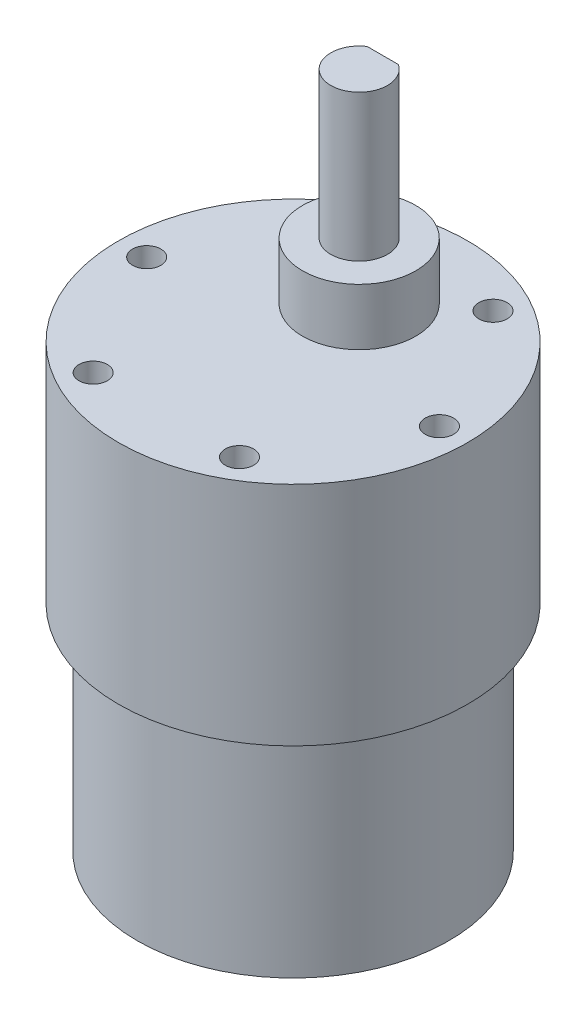
ISO-10303-21;
HEADER;
FILE_DESCRIPTION(('STEP AP214'),'2;1');
FILE_NAME('part.step','',(''),(''),'','','');
FILE_SCHEMA(('AUTOMOTIVE_DESIGN { 1 0 10303 214 1 1 1 1 }'));
ENDSEC;
DATA;
#1=APPLICATION_CONTEXT('core data for automotive mechanical design processes');
#2=APPLICATION_PROTOCOL_DEFINITION('international standard','automotive_design',2000,#1);
#3=PRODUCT_CONTEXT('',#1,'mechanical');
#4=PRODUCT('Part','Part','',(#3));
#5=PRODUCT_RELATED_PRODUCT_CATEGORY('part','',(#4));
#6=PRODUCT_DEFINITION_FORMATION('','',#4);
#7=PRODUCT_DEFINITION_CONTEXT('part definition',#1,'design');
#8=PRODUCT_DEFINITION('design','',#6,#7);
#9=PRODUCT_DEFINITION_SHAPE('','',#8);
#10=(LENGTH_UNIT() NAMED_UNIT(*) SI_UNIT(.MILLI.,.METRE.));
#11=(NAMED_UNIT(*) PLANE_ANGLE_UNIT() SI_UNIT($,.RADIAN.));
#12=(NAMED_UNIT(*) SI_UNIT($,.STERADIAN.) SOLID_ANGLE_UNIT());
#13=UNCERTAINTY_MEASURE_WITH_UNIT(LENGTH_MEASURE(1.E-05),#10,'distance_accuracy_value','');
#14=(GEOMETRIC_REPRESENTATION_CONTEXT(3) GLOBAL_UNCERTAINTY_ASSIGNED_CONTEXT((#13)) GLOBAL_UNIT_ASSIGNED_CONTEXT((#10,
#11,#12)) REPRESENTATION_CONTEXT('',''));
#15=CARTESIAN_POINT('',(0.,0.,0.));
#16=DIRECTION('',(0.,0.,1.));
#17=DIRECTION('',(1.,0.,0.));
#18=AXIS2_PLACEMENT_3D('',#15,#16,#17);
#19=CARTESIAN_POINT('',(0.,0.,0.));
#20=DIRECTION('',(0.,1.,0.));
#21=DIRECTION('',(0.,0.,1.));
#22=AXIS2_PLACEMENT_3D('',#19,#20,#21);
#23=PLANE('',#22);
#24=CARTESIAN_POINT('',(0.,0.,0.));
#25=DIRECTION('',(0.,1.,0.));
#26=DIRECTION('',(0.,0.,1.));
#27=AXIS2_PLACEMENT_3D('',#24,#25,#26);
#28=CIRCLE('',#27,16.5);
#29=CARTESIAN_POINT('',(0.,0.,16.5));
#30=VERTEX_POINT('',#29);
#31=EDGE_CURVE('E91',#30,#30,#28,.T.);
#32=ORIENTED_EDGE('',*,*,#31,.F.);
#33=EDGE_LOOP('',(#32));
#34=FACE_BOUND('',#33,.T.);
#35=CARTESIAN_POINT('',(0.,0.,0.));
#36=DIRECTION('',(0.,1.,0.));
#37=DIRECTION('',(0.,0.,1.));
#38=AXIS2_PLACEMENT_3D('',#35,#36,#37);
#39=CIRCLE('',#38,5.);
#40=CARTESIAN_POINT('',(0.,0.,5.));
#41=VERTEX_POINT('',#40);
#42=EDGE_CURVE('E97',#41,#41,#39,.F.);
#43=ORIENTED_EDGE('',*,*,#42,.F.);
#44=EDGE_LOOP('',(#43));
#45=FACE_BOUND('',#44,.T.);
#46=ADVANCED_FACE('F34',(#34,#45),#23,.F.);
#47=CARTESIAN_POINT('',(0.,52.7,-7.));
#48=DIRECTION('',(0.,1.,0.));
#49=DIRECTION('',(0.,0.,1.));
#50=AXIS2_PLACEMENT_3D('',#47,#48,#49);
#51=PLANE('',#50);
#52=CARTESIAN_POINT('',(0.,52.7,-7.));
#53=DIRECTION('',(0.,1.,0.));
#54=DIRECTION('',(0.,0.,1.));
#55=AXIS2_PLACEMENT_3D('',#52,#53,#54);
#56=CIRCLE('',#55,6.);
#57=CARTESIAN_POINT('',(0.,52.7,-0.999999999999999));
#58=VERTEX_POINT('',#57);
#59=EDGE_CURVE('E79',#58,#58,#56,.T.);
#60=ORIENTED_EDGE('',*,*,#59,.T.);
#61=EDGE_LOOP('',(#60));
#62=FACE_BOUND('',#61,.T.);
#63=CARTESIAN_POINT('',(0.,52.7,-7.));
#64=DIRECTION('',(0.,1.,0.));
#65=DIRECTION('',(0.,0.,1.));
#66=AXIS2_PLACEMENT_3D('',#63,#64,#65);
#67=CIRCLE('',#66,3.);
#68=CARTESIAN_POINT('',(0.,52.7,-4.));
#69=VERTEX_POINT('',#68);
#70=EDGE_CURVE('E73',#69,#69,#67,.T.);
#71=ORIENTED_EDGE('',*,*,#70,.F.);
#72=EDGE_LOOP('',(#71));
#73=FACE_BOUND('',#72,.T.);
#74=ADVANCED_FACE('F115',(#62,#73),#51,.T.);
#75=CARTESIAN_POINT('',(0.,46.7,0.));
#76=DIRECTION('',(0.,1.,0.));
#77=DIRECTION('',(0.,0.,1.));
#78=AXIS2_PLACEMENT_3D('',#75,#76,#77);
#79=PLANE('',#78);
#80=CARTESIAN_POINT('',(7.75000000000016,46.7,-13.4233937586587));
#81=DIRECTION('',(0.,1.,0.));
#82=DIRECTION('',(0.,0.,1.));
#83=AXIS2_PLACEMENT_3D('',#80,#81,#82);
#84=CIRCLE('',#83,1.5);
#85=CARTESIAN_POINT('',(7.75000000000016,46.7,-11.9233937586587));
#86=VERTEX_POINT('',#85);
#87=EDGE_CURVE('E387',#86,#86,#84,.T.);
#88=ORIENTED_EDGE('',*,*,#87,.F.);
#89=EDGE_LOOP('',(#88));
#90=FACE_BOUND('',#89,.T.);
#91=CARTESIAN_POINT('',(-7.74999999999987,46.7,-13.4233937586589));
#92=DIRECTION('',(0.,1.,0.));
#93=DIRECTION('',(0.,0.,1.));
#94=AXIS2_PLACEMENT_3D('',#91,#92,#93);
#95=CIRCLE('',#94,1.5);
#96=CARTESIAN_POINT('',(-7.74999999999987,46.7,-11.9233937586589));
#97=VERTEX_POINT('',#96);
#98=EDGE_CURVE('E386',#97,#97,#95,.T.);
#99=ORIENTED_EDGE('',*,*,#98,.F.);
#100=EDGE_LOOP('',(#99));
#101=FACE_BOUND('',#100,.T.);
#102=CARTESIAN_POINT('',(-15.5,46.7,-1.08235921504137E-13));
#103=DIRECTION('',(0.,1.,0.));
#104=DIRECTION('',(0.,0.,1.));
#105=AXIS2_PLACEMENT_3D('',#102,#103,#104);
#106=CIRCLE('',#105,1.5);
#107=CARTESIAN_POINT('',(-15.5,46.7,1.49999999999989));
#108=VERTEX_POINT('',#107);
#109=EDGE_CURVE('E396',#108,#108,#106,.T.);
#110=ORIENTED_EDGE('',*,*,#109,.F.);
#111=EDGE_LOOP('',(#110));
#112=FACE_BOUND('',#111,.T.);
#113=CARTESIAN_POINT('',(-7.75000000000006,46.7,13.4233937586588));
#114=DIRECTION('',(0.,1.,0.));
#115=DIRECTION('',(0.,0.,1.));
#116=AXIS2_PLACEMENT_3D('',#113,#114,#115);
#117=CIRCLE('',#116,1.5);
#118=CARTESIAN_POINT('',(-7.75000000000006,46.7,14.9233937586588));
#119=VERTEX_POINT('',#118);
#120=EDGE_CURVE('E401',#119,#119,#117,.T.);
#121=ORIENTED_EDGE('',*,*,#120,.F.);
#122=EDGE_LOOP('',(#121));
#123=FACE_BOUND('',#122,.T.);
#124=CARTESIAN_POINT('',(7.74999999999997,46.7,13.4233937586588));
#125=DIRECTION('',(0.,1.,0.));
#126=DIRECTION('',(0.,0.,1.));
#127=AXIS2_PLACEMENT_3D('',#124,#125,#126);
#128=CIRCLE('',#127,1.5);
#129=CARTESIAN_POINT('',(7.74999999999997,46.7,14.9233937586588));
#130=VERTEX_POINT('',#129);
#131=EDGE_CURVE('E407',#130,#130,#128,.T.);
#132=ORIENTED_EDGE('',*,*,#131,.F.);
#133=EDGE_LOOP('',(#132));
#134=FACE_BOUND('',#133,.T.);
#135=CARTESIAN_POINT('',(15.5,46.7,0.));
#136=DIRECTION('',(0.,1.,0.));
#137=DIRECTION('',(0.,0.,1.));
#138=AXIS2_PLACEMENT_3D('',#135,#136,#137);
#139=CIRCLE('',#138,1.5);
#140=CARTESIAN_POINT('',(15.5,46.7,1.5));
#141=VERTEX_POINT('',#140);
#142=EDGE_CURVE('E413',#141,#141,#139,.T.);
#143=ORIENTED_EDGE('',*,*,#142,.F.);
#144=EDGE_LOOP('',(#143));
#145=FACE_BOUND('',#144,.T.);
#146=CARTESIAN_POINT('',(0.,46.7,0.));
#147=DIRECTION('',(0.,1.,0.));
#148=DIRECTION('',(0.,0.,1.));
#149=AXIS2_PLACEMENT_3D('',#146,#147,#148);
#150=CIRCLE('',#149,18.5);
#151=CARTESIAN_POINT('',(0.,46.7,18.5));
#152=VERTEX_POINT('',#151);
#153=EDGE_CURVE('E88',#152,#152,#150,.T.);
#154=ORIENTED_EDGE('',*,*,#153,.T.);
#155=EDGE_LOOP('',(#154));
#156=FACE_BOUND('',#155,.T.);
#157=CARTESIAN_POINT('',(0.,46.7,-7.));
#158=DIRECTION('',(0.,1.,0.));
#159=DIRECTION('',(0.,0.,1.));
#160=AXIS2_PLACEMENT_3D('',#157,#158,#159);
#161=CIRCLE('',#160,6.);
#162=CARTESIAN_POINT('',(0.,46.7,-0.999999999999999));
#163=VERTEX_POINT('',#162);
#164=EDGE_CURVE('E76',#163,#163,#161,.T.);
#165=ORIENTED_EDGE('',*,*,#164,.F.);
#166=EDGE_LOOP('',(#165));
#167=FACE_BOUND('',#166,.T.);
#168=ADVANCED_FACE('F121',(#90,#101,#112,#123,#134,#145,#156,#167),#79,.T.);
#169=CARTESIAN_POINT('',(0.,22.7,0.));
#170=DIRECTION('',(0.,-1.,0.));
#171=DIRECTION('',(0.,0.,-1.));
#172=AXIS2_PLACEMENT_3D('',#169,#170,#171);
#173=CYLINDRICAL_SURFACE('',#172,16.5);
#174=CARTESIAN_POINT('',(0.,22.7,0.));
#175=DIRECTION('',(0.,1.,0.));
#176=DIRECTION('',(0.,0.,1.));
#177=AXIS2_PLACEMENT_3D('',#174,#175,#176);
#178=CIRCLE('',#177,16.5);
#179=CARTESIAN_POINT('',(0.,22.7,16.5));
#180=VERTEX_POINT('',#179);
#181=EDGE_CURVE('E94',#180,#180,#178,.T.);
#182=ORIENTED_EDGE('',*,*,#181,.F.);
#183=EDGE_LOOP('',(#182));
#184=FACE_BOUND('',#183,.T.);
#185=ORIENTED_EDGE('',*,*,#31,.T.);
#186=EDGE_LOOP('',(#185));
#187=FACE_BOUND('',#186,.T.);
#188=ADVANCED_FACE('F129',(#184,#187),#173,.T.);
#189=CARTESIAN_POINT('',(0.,22.7,0.));
#190=DIRECTION('',(0.,1.,0.));
#191=DIRECTION('',(0.,0.,1.));
#192=AXIS2_PLACEMENT_3D('',#189,#190,#191);
#193=PLANE('',#192);
#194=CARTESIAN_POINT('',(0.,22.7,0.));
#195=DIRECTION('',(0.,1.,0.));
#196=DIRECTION('',(0.,0.,1.));
#197=AXIS2_PLACEMENT_3D('',#194,#195,#196);
#198=CIRCLE('',#197,18.5);
#199=CARTESIAN_POINT('',(0.,22.7,18.5));
#200=VERTEX_POINT('',#199);
#201=EDGE_CURVE('E86',#200,#200,#198,.T.);
#202=ORIENTED_EDGE('',*,*,#201,.F.);
#203=EDGE_LOOP('',(#202));
#204=FACE_BOUND('',#203,.T.);
#205=ORIENTED_EDGE('',*,*,#181,.T.);
#206=EDGE_LOOP('',(#205));
#207=FACE_BOUND('',#206,.T.);
#208=ADVANCED_FACE('F131',(#204,#207),#193,.F.);
#209=CARTESIAN_POINT('',(0.,46.7,0.));
#210=DIRECTION('',(0.,-1.,0.));
#211=DIRECTION('',(0.,0.,-1.));
#212=AXIS2_PLACEMENT_3D('',#209,#210,#211);
#213=CYLINDRICAL_SURFACE('',#212,18.5);
#214=ORIENTED_EDGE('',*,*,#153,.F.);
#215=EDGE_LOOP('',(#214));
#216=FACE_BOUND('',#215,.T.);
#217=ORIENTED_EDGE('',*,*,#201,.T.);
#218=EDGE_LOOP('',(#217));
#219=FACE_BOUND('',#218,.T.);
#220=ADVANCED_FACE('F127',(#216,#219),#213,.T.);
#221=CARTESIAN_POINT('',(0.,52.7,-7.));
#222=DIRECTION('',(0.,-1.,0.));
#223=DIRECTION('',(0.,0.,-1.));
#224=AXIS2_PLACEMENT_3D('',#221,#222,#223);
#225=CYLINDRICAL_SURFACE('',#224,6.);
#226=ORIENTED_EDGE('',*,*,#59,.F.);
#227=EDGE_LOOP('',(#226));
#228=FACE_BOUND('',#227,.T.);
#229=ORIENTED_EDGE('',*,*,#164,.T.);
#230=EDGE_LOOP('',(#229));
#231=FACE_BOUND('',#230,.T.);
#232=ADVANCED_FACE('F148',(#228,#231),#225,.T.);
#233=CARTESIAN_POINT('',(0.,68.2,-7.));
#234=DIRECTION('',(0.,-1.,0.));
#235=DIRECTION('',(0.,0.,-1.));
#236=AXIS2_PLACEMENT_3D('',#233,#234,#235);
#237=CYLINDRICAL_SURFACE('',#236,3.);
#238=CARTESIAN_POINT('',(0.,68.2,-7.));
#239=DIRECTION('',(0.,1.,0.));
#240=DIRECTION('',(0.,0.,1.));
#241=AXIS2_PLACEMENT_3D('',#238,#239,#240);
#242=CIRCLE('',#241,3.);
#243=CARTESIAN_POINT('',(-1.6583123951777,68.2,-9.5));
#244=VERTEX_POINT('',#243);
#245=CARTESIAN_POINT('',(1.6583123951777,68.2,-9.5));
#246=VERTEX_POINT('',#245);
#247=EDGE_CURVE('E72',#244,#246,#242,.T.);
#248=ORIENTED_EDGE('',*,*,#247,.F.);
#249=DIRECTION('',(0.,1.,0.));
#250=VECTOR('',#249,1.);
#251=CARTESIAN_POINT('',(-1.6583123951777,56.2,-9.5));
#252=LINE('',#251,#250);
#253=CARTESIAN_POINT('',(-1.6583123951777,56.2,-9.5));
#254=VERTEX_POINT('',#253);
#255=EDGE_CURVE('E49',#254,#244,#252,.T.);
#256=ORIENTED_EDGE('',*,*,#255,.F.);
#257=CARTESIAN_POINT('',(0.,56.2,-7.));
#258=DIRECTION('',(0.,1.,0.));
#259=DIRECTION('',(0.,0.,1.));
#260=AXIS2_PLACEMENT_3D('',#257,#258,#259);
#261=CIRCLE('',#260,3.);
#262=CARTESIAN_POINT('',(1.6583123951777,56.2,-9.5));
#263=VERTEX_POINT('',#262);
#264=EDGE_CURVE('E65',#263,#254,#261,.T.);
#265=ORIENTED_EDGE('',*,*,#264,.F.);
#266=DIRECTION('',(0.,1.,0.));
#267=VECTOR('',#266,1.);
#268=CARTESIAN_POINT('',(1.6583123951777,56.2,-9.5));
#269=LINE('',#268,#267);
#270=EDGE_CURVE('E55',#263,#246,#269,.T.);
#271=ORIENTED_EDGE('',*,*,#270,.T.);
#272=EDGE_LOOP('',(#248,#256,#265,#271));
#273=FACE_BOUND('',#272,.T.);
#274=ORIENTED_EDGE('',*,*,#70,.T.);
#275=EDGE_LOOP('',(#274));
#276=FACE_BOUND('',#275,.T.);
#277=ADVANCED_FACE('F70',(#273,#276),#237,.T.);
#278=CARTESIAN_POINT('',(0.,68.2,-7.));
#279=DIRECTION('',(0.,1.,0.));
#280=DIRECTION('',(0.,0.,1.));
#281=AXIS2_PLACEMENT_3D('',#278,#279,#280);
#282=PLANE('',#281);
#283=DIRECTION('',(1.,0.,0.));
#284=VECTOR('',#283,1.);
#285=CARTESIAN_POINT('',(0.,68.2,-9.5));
#286=LINE('',#285,#284);
#287=EDGE_CURVE('E60',#244,#246,#286,.T.);
#288=ORIENTED_EDGE('',*,*,#287,.F.);
#289=ORIENTED_EDGE('',*,*,#247,.T.);
#290=EDGE_LOOP('',(#288,#289));
#291=FACE_BOUND('',#290,.T.);
#292=ADVANCED_FACE('F75',(#291),#282,.T.);
#293=CARTESIAN_POINT('',(0.,56.2,-9.5));
#294=DIRECTION('',(0.,0.,1.));
#295=DIRECTION('',(1.,0.,0.));
#296=AXIS2_PLACEMENT_3D('',#293,#294,#295);
#297=PLANE('',#296);
#298=ORIENTED_EDGE('',*,*,#287,.T.);
#299=ORIENTED_EDGE('',*,*,#270,.F.);
#300=DIRECTION('',(1.,0.,0.));
#301=VECTOR('',#300,1.);
#302=CARTESIAN_POINT('',(0.,56.2,-9.5));
#303=LINE('',#302,#301);
#304=EDGE_CURVE('E421',#254,#263,#303,.T.);
#305=ORIENTED_EDGE('',*,*,#304,.F.);
#306=ORIENTED_EDGE('',*,*,#255,.T.);
#307=EDGE_LOOP('',(#298,#299,#305,#306));
#308=FACE_BOUND('',#307,.T.);
#309=ADVANCED_FACE('F61',(#308),#297,.F.);
#310=CARTESIAN_POINT('',(0.,56.2,0.));
#311=DIRECTION('',(0.,1.,0.));
#312=DIRECTION('',(0.,0.,1.));
#313=AXIS2_PLACEMENT_3D('',#310,#311,#312);
#314=PLANE('',#313);
#315=ORIENTED_EDGE('',*,*,#264,.T.);
#316=ORIENTED_EDGE('',*,*,#304,.T.);
#317=EDGE_LOOP('',(#315,#316));
#318=FACE_BOUND('',#317,.T.);
#319=ADVANCED_FACE('F158',(#318),#314,.T.);
#320=CARTESIAN_POINT('',(15.5,36.7,0.));
#321=DIRECTION('',(0.,1.,0.));
#322=DIRECTION('',(0.,0.,1.));
#323=AXIS2_PLACEMENT_3D('',#320,#321,#322);
#324=CYLINDRICAL_SURFACE('',#323,1.5);
#325=CARTESIAN_POINT('',(15.5,36.7,0.));
#326=DIRECTION('',(0.,1.,0.));
#327=DIRECTION('',(0.,0.,1.));
#328=AXIS2_PLACEMENT_3D('',#325,#326,#327);
#329=CIRCLE('',#328,1.5);
#330=CARTESIAN_POINT('',(15.5,36.7,1.5));
#331=VERTEX_POINT('',#330);
#332=EDGE_CURVE('E66',#331,#331,#329,.T.);
#333=ORIENTED_EDGE('',*,*,#332,.F.);
#334=EDGE_LOOP('',(#333));
#335=FACE_BOUND('',#334,.T.);
#336=ORIENTED_EDGE('',*,*,#142,.T.);
#337=EDGE_LOOP('',(#336));
#338=FACE_BOUND('',#337,.T.);
#339=ADVANCED_FACE('F161',(#335,#338),#324,.F.);
#340=CARTESIAN_POINT('',(15.5,36.7,0.));
#341=DIRECTION('',(0.,1.,0.));
#342=DIRECTION('',(0.,0.,1.));
#343=AXIS2_PLACEMENT_3D('',#340,#341,#342);
#344=PLANE('',#343);
#345=ORIENTED_EDGE('',*,*,#332,.T.);
#346=EDGE_LOOP('',(#345));
#347=FACE_BOUND('',#346,.T.);
#348=ADVANCED_FACE('F165',(#347),#344,.T.);
#349=CARTESIAN_POINT('',(7.74999999999997,36.7,13.4233937586588));
#350=DIRECTION('',(0.,1.,0.));
#351=DIRECTION('',(0.,0.,1.));
#352=AXIS2_PLACEMENT_3D('',#349,#350,#351);
#353=CYLINDRICAL_SURFACE('',#352,1.5);
#354=CARTESIAN_POINT('',(7.74999999999997,36.7,13.4233937586588));
#355=DIRECTION('',(0.,1.,0.));
#356=DIRECTION('',(0.,0.,1.));
#357=AXIS2_PLACEMENT_3D('',#354,#355,#356);
#358=CIRCLE('',#357,1.5);
#359=CARTESIAN_POINT('',(7.74999999999997,36.7,14.9233937586588));
#360=VERTEX_POINT('',#359);
#361=EDGE_CURVE('E410',#360,#360,#358,.T.);
#362=ORIENTED_EDGE('',*,*,#361,.F.);
#363=EDGE_LOOP('',(#362));
#364=FACE_BOUND('',#363,.T.);
#365=ORIENTED_EDGE('',*,*,#131,.T.);
#366=EDGE_LOOP('',(#365));
#367=FACE_BOUND('',#366,.T.);
#368=ADVANCED_FACE('F169',(#364,#367),#353,.F.);
#369=CARTESIAN_POINT('',(7.74999999999997,36.7,13.4233937586588));
#370=DIRECTION('',(0.,1.,0.));
#371=DIRECTION('',(0.,0.,1.));
#372=AXIS2_PLACEMENT_3D('',#369,#370,#371);
#373=PLANE('',#372);
#374=ORIENTED_EDGE('',*,*,#361,.T.);
#375=EDGE_LOOP('',(#374));
#376=FACE_BOUND('',#375,.T.);
#377=ADVANCED_FACE('F173',(#376),#373,.T.);
#378=CARTESIAN_POINT('',(-7.75000000000006,36.7,13.4233937586588));
#379=DIRECTION('',(0.,1.,0.));
#380=DIRECTION('',(0.,0.,1.));
#381=AXIS2_PLACEMENT_3D('',#378,#379,#380);
#382=CYLINDRICAL_SURFACE('',#381,1.5);
#383=CARTESIAN_POINT('',(-7.75000000000006,36.7,13.4233937586588));
#384=DIRECTION('',(0.,1.,0.));
#385=DIRECTION('',(0.,0.,1.));
#386=AXIS2_PLACEMENT_3D('',#383,#384,#385);
#387=CIRCLE('',#386,1.5);
#388=CARTESIAN_POINT('',(-7.75000000000006,36.7,14.9233937586588));
#389=VERTEX_POINT('',#388);
#390=EDGE_CURVE('E404',#389,#389,#387,.T.);
#391=ORIENTED_EDGE('',*,*,#390,.F.);
#392=EDGE_LOOP('',(#391));
#393=FACE_BOUND('',#392,.T.);
#394=ORIENTED_EDGE('',*,*,#120,.T.);
#395=EDGE_LOOP('',(#394));
#396=FACE_BOUND('',#395,.T.);
#397=ADVANCED_FACE('F177',(#393,#396),#382,.F.);
#398=CARTESIAN_POINT('',(-7.75000000000006,36.7,13.4233937586588));
#399=DIRECTION('',(0.,1.,0.));
#400=DIRECTION('',(0.,0.,1.));
#401=AXIS2_PLACEMENT_3D('',#398,#399,#400);
#402=PLANE('',#401);
#403=ORIENTED_EDGE('',*,*,#390,.T.);
#404=EDGE_LOOP('',(#403));
#405=FACE_BOUND('',#404,.T.);
#406=ADVANCED_FACE('F181',(#405),#402,.T.);
#407=CARTESIAN_POINT('',(-15.5,36.7,-1.08235921504137E-13));
#408=DIRECTION('',(0.,1.,0.));
#409=DIRECTION('',(0.,0.,1.));
#410=AXIS2_PLACEMENT_3D('',#407,#408,#409);
#411=CYLINDRICAL_SURFACE('',#410,1.5);
#412=CARTESIAN_POINT('',(-15.5,36.7,-1.08235921504137E-13));
#413=DIRECTION('',(0.,1.,0.));
#414=DIRECTION('',(0.,0.,1.));
#415=AXIS2_PLACEMENT_3D('',#412,#413,#414);
#416=CIRCLE('',#415,1.5);
#417=CARTESIAN_POINT('',(-15.5,36.7,1.49999999999989));
#418=VERTEX_POINT('',#417);
#419=EDGE_CURVE('E398',#418,#418,#416,.T.);
#420=ORIENTED_EDGE('',*,*,#419,.F.);
#421=EDGE_LOOP('',(#420));
#422=FACE_BOUND('',#421,.T.);
#423=ORIENTED_EDGE('',*,*,#109,.T.);
#424=EDGE_LOOP('',(#423));
#425=FACE_BOUND('',#424,.T.);
#426=ADVANCED_FACE('F185',(#422,#425),#411,.F.);
#427=CARTESIAN_POINT('',(-15.5,36.7,-1.08235921504137E-13));
#428=DIRECTION('',(0.,1.,0.));
#429=DIRECTION('',(0.,0.,1.));
#430=AXIS2_PLACEMENT_3D('',#427,#428,#429);
#431=PLANE('',#430);
#432=ORIENTED_EDGE('',*,*,#419,.T.);
#433=EDGE_LOOP('',(#432));
#434=FACE_BOUND('',#433,.T.);
#435=ADVANCED_FACE('F189',(#434),#431,.T.);
#436=CARTESIAN_POINT('',(-7.74999999999987,36.7,-13.4233937586589));
#437=DIRECTION('',(0.,1.,0.));
#438=DIRECTION('',(0.,0.,1.));
#439=AXIS2_PLACEMENT_3D('',#436,#437,#438);
#440=CYLINDRICAL_SURFACE('',#439,1.5);
#441=CARTESIAN_POINT('',(-7.74999999999987,36.7,-13.4233937586589));
#442=DIRECTION('',(0.,1.,0.));
#443=DIRECTION('',(0.,0.,1.));
#444=AXIS2_PLACEMENT_3D('',#441,#442,#443);
#445=CIRCLE('',#444,1.5);
#446=CARTESIAN_POINT('',(-7.74999999999987,36.7,-11.9233937586589));
#447=VERTEX_POINT('',#446);
#448=EDGE_CURVE('E390',#447,#447,#445,.T.);
#449=ORIENTED_EDGE('',*,*,#448,.F.);
#450=EDGE_LOOP('',(#449));
#451=FACE_BOUND('',#450,.T.);
#452=ORIENTED_EDGE('',*,*,#98,.T.);
#453=EDGE_LOOP('',(#452));
#454=FACE_BOUND('',#453,.T.);
#455=ADVANCED_FACE('F193',(#451,#454),#440,.F.);
#456=CARTESIAN_POINT('',(-7.74999999999987,36.7,-13.4233937586589));
#457=DIRECTION('',(0.,1.,0.));
#458=DIRECTION('',(0.,0.,1.));
#459=AXIS2_PLACEMENT_3D('',#456,#457,#458);
#460=PLANE('',#459);
#461=ORIENTED_EDGE('',*,*,#448,.T.);
#462=EDGE_LOOP('',(#461));
#463=FACE_BOUND('',#462,.T.);
#464=ADVANCED_FACE('F197',(#463),#460,.T.);
#465=CARTESIAN_POINT('',(7.75000000000016,36.7,-13.4233937586587));
#466=DIRECTION('',(0.,1.,0.));
#467=DIRECTION('',(0.,0.,1.));
#468=AXIS2_PLACEMENT_3D('',#465,#466,#467);
#469=CYLINDRICAL_SURFACE('',#468,1.5);
#470=CARTESIAN_POINT('',(7.75000000000016,36.7,-13.4233937586587));
#471=DIRECTION('',(0.,1.,0.));
#472=DIRECTION('',(0.,0.,1.));
#473=AXIS2_PLACEMENT_3D('',#470,#471,#472);
#474=CIRCLE('',#473,1.5);
#475=CARTESIAN_POINT('',(7.75000000000016,36.7,-11.9233937586587));
#476=VERTEX_POINT('',#475);
#477=EDGE_CURVE('E385',#476,#476,#474,.T.);
#478=ORIENTED_EDGE('',*,*,#477,.F.);
#479=EDGE_LOOP('',(#478));
#480=FACE_BOUND('',#479,.T.);
#481=ORIENTED_EDGE('',*,*,#87,.T.);
#482=EDGE_LOOP('',(#481));
#483=FACE_BOUND('',#482,.T.);
#484=ADVANCED_FACE('F201',(#480,#483),#469,.F.);
#485=CARTESIAN_POINT('',(7.75000000000016,36.7,-13.4233937586587));
#486=DIRECTION('',(0.,1.,0.));
#487=DIRECTION('',(0.,0.,1.));
#488=AXIS2_PLACEMENT_3D('',#485,#486,#487);
#489=PLANE('',#488);
#490=ORIENTED_EDGE('',*,*,#477,.T.);
#491=EDGE_LOOP('',(#490));
#492=FACE_BOUND('',#491,.T.);
#493=ADVANCED_FACE('F205',(#492),#489,.T.);
#494=CARTESIAN_POINT('',(0.,-2.,0.));
#495=DIRECTION('',(0.,1.,0.));
#496=DIRECTION('',(0.,0.,1.));
#497=AXIS2_PLACEMENT_3D('',#494,#495,#496);
#498=CYLINDRICAL_SURFACE('',#497,5.);
#499=CARTESIAN_POINT('',(0.,-1.5,0.));
#500=DIRECTION('',(0.,-1.,0.));
#501=DIRECTION('',(0.,0.,-1.));
#502=AXIS2_PLACEMENT_3D('',#499,#500,#501);
#503=CIRCLE('',#502,5.);
#504=CARTESIAN_POINT('',(0.,-1.5,-5.));
#505=VERTEX_POINT('',#504);
#506=EDGE_CURVE('E11',#505,#505,#503,.F.);
#507=ORIENTED_EDGE('',*,*,#506,.T.);
#508=EDGE_LOOP('',(#507));
#509=FACE_BOUND('',#508,.T.);
#510=ORIENTED_EDGE('',*,*,#42,.T.);
#511=EDGE_LOOP('',(#510));
#512=FACE_BOUND('',#511,.T.);
#513=ADVANCED_FACE('F111',(#509,#512),#498,.T.);
#514=CARTESIAN_POINT('',(0.,-2.,0.));
#515=DIRECTION('',(0.,-1.,0.));
#516=DIRECTION('',(0.,0.,-1.));
#517=AXIS2_PLACEMENT_3D('',#514,#515,#516);
#518=PLANE('',#517);
#519=CARTESIAN_POINT('',(0.,-2.,0.));
#520=DIRECTION('',(0.,-1.,0.));
#521=DIRECTION('',(0.,0.,-1.));
#522=AXIS2_PLACEMENT_3D('',#519,#520,#521);
#523=CIRCLE('',#522,4.5);
#524=CARTESIAN_POINT('',(0.,-2.,-4.5));
#525=VERTEX_POINT('',#524);
#526=EDGE_CURVE('E42',#525,#525,#523,.T.);
#527=ORIENTED_EDGE('',*,*,#526,.T.);
#528=EDGE_LOOP('',(#527));
#529=FACE_BOUND('',#528,.T.);
#530=ADVANCED_FACE('F104',(#529),#518,.T.);
#531=CARTESIAN_POINT('',(0.,-1.5,0.));
#532=DIRECTION('',(0.,-1.,0.));
#533=DIRECTION('',(0.,0.,-1.));
#534=AXIS2_PLACEMENT_3D('',#531,#532,#533);
#535=TOROIDAL_SURFACE('',#534,4.5,0.5);
#536=ORIENTED_EDGE('',*,*,#506,.F.);
#537=EDGE_LOOP('',(#536));
#538=FACE_BOUND('',#537,.T.);
#539=ORIENTED_EDGE('',*,*,#526,.F.);
#540=EDGE_LOOP('',(#539));
#541=FACE_BOUND('',#540,.T.);
#542=ADVANCED_FACE('F36',(#538,#541),#535,.T.);
#543=CLOSED_SHELL('',(#46,#74,#168,#188,#208,#220,#232,#277,#292,#309,#319,#339,#348,#368,#377,
#397,#406,#426,#435,#455,#464,#484,#493,#513,#530,#542));
#544=MANIFOLD_SOLID_BREP('B2',#543);
#545=ADVANCED_BREP_SHAPE_REPRESENTATION('',(#18,#544),#14);
#546=SHAPE_DEFINITION_REPRESENTATION(#9,#545);
ENDSEC;
END-ISO-10303-21;
